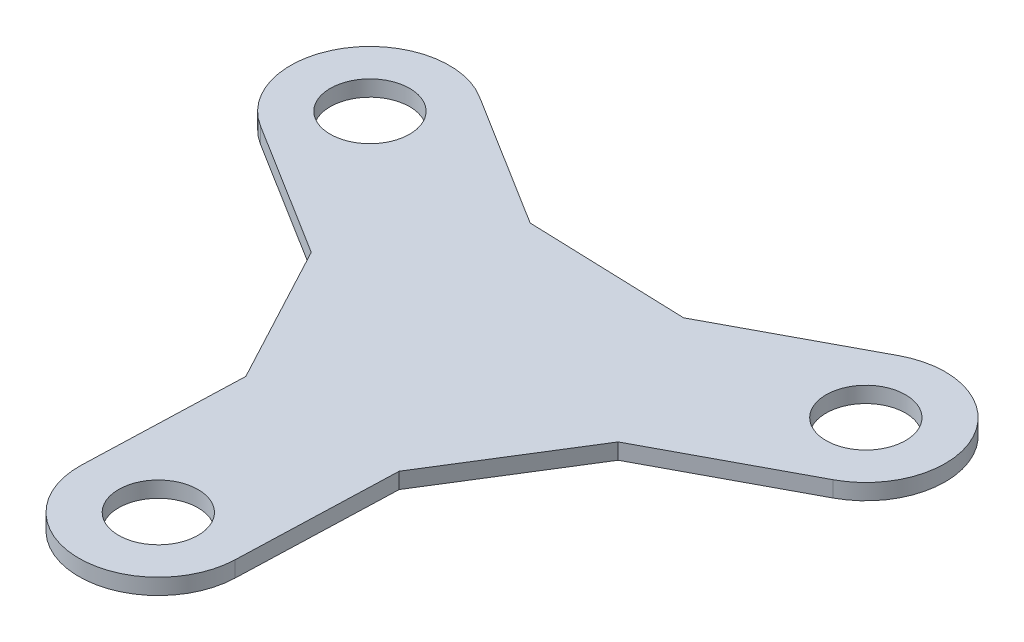
ISO-10303-21;
HEADER;
FILE_DESCRIPTION(('STEP AP214'),'2;1');
FILE_NAME('part.step','',(''),(''),'','','');
FILE_SCHEMA(('AUTOMOTIVE_DESIGN { 1 0 10303 214 1 1 1 1 }'));
ENDSEC;
DATA;
#1=APPLICATION_CONTEXT('core data for automotive mechanical design processes');
#2=APPLICATION_PROTOCOL_DEFINITION('international standard','automotive_design',2000,#1);
#3=PRODUCT_CONTEXT('',#1,'mechanical');
#4=PRODUCT('Part','Part','',(#3));
#5=PRODUCT_RELATED_PRODUCT_CATEGORY('part','',(#4));
#6=PRODUCT_DEFINITION_FORMATION('','',#4);
#7=PRODUCT_DEFINITION_CONTEXT('part definition',#1,'design');
#8=PRODUCT_DEFINITION('design','',#6,#7);
#9=PRODUCT_DEFINITION_SHAPE('','',#8);
#10=(LENGTH_UNIT() NAMED_UNIT(*) SI_UNIT(.MILLI.,.METRE.));
#11=(NAMED_UNIT(*) PLANE_ANGLE_UNIT() SI_UNIT($,.RADIAN.));
#12=(NAMED_UNIT(*) SI_UNIT($,.STERADIAN.) SOLID_ANGLE_UNIT());
#13=UNCERTAINTY_MEASURE_WITH_UNIT(LENGTH_MEASURE(1.E-05),#10,'distance_accuracy_value','');
#14=(GEOMETRIC_REPRESENTATION_CONTEXT(3) GLOBAL_UNCERTAINTY_ASSIGNED_CONTEXT((#13)) GLOBAL_UNIT_ASSIGNED_CONTEXT((#10,
#11,#12)) REPRESENTATION_CONTEXT('',''));
#15=CARTESIAN_POINT('',(0.,0.,0.));
#16=DIRECTION('',(0.,0.,1.));
#17=DIRECTION('',(1.,0.,0.));
#18=AXIS2_PLACEMENT_3D('',#15,#16,#17);
#19=CARTESIAN_POINT('',(9.40770567018427,-2.,17.6492230430459));
#20=DIRECTION('',(0.848596181161472,0.,0.529041133862166));
#21=DIRECTION('',(0.529041133862166,0.,-0.848596181161472));
#22=AXIS2_PLACEMENT_3D('',#19,#20,#21);
#23=PLANE('',#22);
#24=DIRECTION('',(0.529041133862166,0.,-0.848596181161472));
#25=VECTOR('',#24,1.);
#26=CARTESIAN_POINT('',(9.40770567018427,0.,17.6492230430459));
#27=LINE('',#26,#25);
#28=CARTESIAN_POINT('',(9.40770567018427,0.,17.6492230430459));
#29=VERTEX_POINT('',#28);
#30=CARTESIAN_POINT('',(19.9885283474276,0.,0.677299419816466));
#31=VERTEX_POINT('',#30);
#32=EDGE_CURVE('E136',#29,#31,#27,.T.);
#33=ORIENTED_EDGE('',*,*,#32,.F.);
#34=DIRECTION('',(0.,1.,0.));
#35=VECTOR('',#34,1.);
#36=CARTESIAN_POINT('',(9.40770567018427,-2.,17.6492230430459));
#37=LINE('',#36,#35);
#38=CARTESIAN_POINT('',(9.40770567018427,-2.,17.6492230430459));
#39=VERTEX_POINT('',#38);
#40=EDGE_CURVE('E51',#39,#29,#37,.T.);
#41=ORIENTED_EDGE('',*,*,#40,.F.);
#42=DIRECTION('',(0.529041133862166,0.,-0.848596181161472));
#43=VECTOR('',#42,1.);
#44=CARTESIAN_POINT('',(9.40770567018427,-2.,17.6492230430459));
#45=LINE('',#44,#43);
#46=CARTESIAN_POINT('',(19.9885283474276,-2.,0.677299419816466));
#47=VERTEX_POINT('',#46);
#48=EDGE_CURVE('E59',#39,#47,#45,.T.);
#49=ORIENTED_EDGE('',*,*,#48,.T.);
#50=DIRECTION('',(0.,1.,0.));
#51=VECTOR('',#50,1.);
#52=CARTESIAN_POINT('',(19.9885283474276,-2.,0.677299419816466));
#53=LINE('',#52,#51);
#54=EDGE_CURVE('E11',#47,#31,#53,.T.);
#55=ORIENTED_EDGE('',*,*,#54,.T.);
#56=EDGE_LOOP('',(#33,#41,#49,#55));
#57=FACE_BOUND('',#56,.T.);
#58=ADVANCED_FACE('F41',(#57),#23,.T.);
#59=CARTESIAN_POINT('',(-19.9885283474276,-2.,-0.677299419816463));
#60=DIRECTION('',(-0.882461152152295,0.,0.470385283509214));
#61=DIRECTION('',(0.470385283509214,0.,0.882461152152295));
#62=AXIS2_PLACEMENT_3D('',#59,#60,#61);
#63=PLANE('',#62);
#64=DIRECTION('',(0.470385283509214,0.,0.882461152152295));
#65=VECTOR('',#64,1.);
#66=CARTESIAN_POINT('',(-19.9885283474276,0.,-0.677299419816463));
#67=LINE('',#66,#65);
#68=CARTESIAN_POINT('',(-19.9885283474208,0.,-0.677299419816303));
#69=VERTEX_POINT('',#68);
#70=CARTESIAN_POINT('',(-10.5808226772433,0.,16.9719236232294));
#71=VERTEX_POINT('',#70);
#72=EDGE_CURVE('E141',#69,#71,#67,.T.);
#73=ORIENTED_EDGE('',*,*,#72,.F.);
#74=DIRECTION('',(0.,1.,0.));
#75=VECTOR('',#74,1.);
#76=CARTESIAN_POINT('',(-19.9885283474276,-2.,-0.677299419816463));
#77=LINE('',#76,#75);
#78=CARTESIAN_POINT('',(-19.9885283474276,-2.,-0.677299419816463));
#79=VERTEX_POINT('',#78);
#80=EDGE_CURVE('E98',#79,#69,#77,.T.);
#81=ORIENTED_EDGE('',*,*,#80,.F.);
#82=DIRECTION('',(0.470385283509214,0.,0.882461152152295));
#83=VECTOR('',#82,1.);
#84=CARTESIAN_POINT('',(-19.9885283474276,-2.,-0.677299419816463));
#85=LINE('',#84,#83);
#86=CARTESIAN_POINT('',(-10.5808226772433,-2.,16.9719236232294));
#87=VERTEX_POINT('',#86);
#88=EDGE_CURVE('E95',#79,#87,#85,.T.);
#89=ORIENTED_EDGE('',*,*,#88,.T.);
#90=DIRECTION('',(0.,1.,0.));
#91=VECTOR('',#90,1.);
#92=CARTESIAN_POINT('',(-10.5808226772433,-2.,16.9719236232294));
#93=LINE('',#92,#91);
#94=EDGE_CURVE('E74',#87,#71,#93,.T.);
#95=ORIENTED_EDGE('',*,*,#94,.T.);
#96=EDGE_LOOP('',(#73,#81,#89,#95));
#97=FACE_BOUND('',#96,.T.);
#98=ADVANCED_FACE('F96',(#97),#63,.T.);
#99=CARTESIAN_POINT('',(10.5808226772433,-2.,-16.9719236232294));
#100=DIRECTION('',(0.0338649709908231,0.,-0.999426417371379));
#101=DIRECTION('',(-0.999426417371379,0.,-0.0338649709908231));
#102=AXIS2_PLACEMENT_3D('',#99,#100,#101);
#103=PLANE('',#102);
#104=DIRECTION('',(-0.999426417371379,0.,-0.0338649709908231));
#105=VECTOR('',#104,1.);
#106=CARTESIAN_POINT('',(10.5808226772433,0.,-16.9719236232294));
#107=LINE('',#106,#105);
#108=CARTESIAN_POINT('',(10.5808226772466,0.,-16.9719236232234));
#109=VERTEX_POINT('',#108);
#110=CARTESIAN_POINT('',(-9.40770567018427,0.,-17.6492230430459));
#111=VERTEX_POINT('',#110);
#112=EDGE_CURVE('E132',#109,#111,#107,.T.);
#113=ORIENTED_EDGE('',*,*,#112,.F.);
#114=DIRECTION('',(0.,1.,0.));
#115=VECTOR('',#114,1.);
#116=CARTESIAN_POINT('',(10.5808226772433,-2.,-16.9719236232294));
#117=LINE('',#116,#115);
#118=CARTESIAN_POINT('',(10.5808226772433,-2.,-16.9719236232294));
#119=VERTEX_POINT('',#118);
#120=EDGE_CURVE('E45',#119,#109,#117,.T.);
#121=ORIENTED_EDGE('',*,*,#120,.F.);
#122=DIRECTION('',(-0.999426417371379,0.,-0.0338649709908231));
#123=VECTOR('',#122,1.);
#124=CARTESIAN_POINT('',(10.5808226772433,-2.,-16.9719236232294));
#125=LINE('',#124,#123);
#126=CARTESIAN_POINT('',(-9.40770567018427,-2.,-17.6492230430459));
#127=VERTEX_POINT('',#126);
#128=EDGE_CURVE('E103',#119,#127,#125,.T.);
#129=ORIENTED_EDGE('',*,*,#128,.T.);
#130=DIRECTION('',(0.,1.,0.));
#131=VECTOR('',#130,1.);
#132=CARTESIAN_POINT('',(-9.40770567018427,-2.,-17.6492230430459));
#133=LINE('',#132,#131);
#134=EDGE_CURVE('E146',#127,#111,#133,.T.);
#135=ORIENTED_EDGE('',*,*,#134,.T.);
#136=EDGE_LOOP('',(#113,#121,#129,#135));
#137=FACE_BOUND('',#136,.T.);
#138=ADVANCED_FACE('F43',(#137),#103,.T.);
#139=CARTESIAN_POINT('',(0.,-2.,0.));
#140=DIRECTION('',(0.,1.,0.));
#141=DIRECTION('',(0.,0.,1.));
#142=AXIS2_PLACEMENT_3D('',#139,#140,#141);
#143=PLANE('',#142);
#144=ORIENTED_EDGE('',*,*,#128,.F.);
#145=DIRECTION('',(0.882461152152296,0.,-0.470385283509213));
#146=VECTOR('',#145,1.);
#147=CARTESIAN_POINT('',(28.2300457202925,-2.,-26.3796292934077));
#148=LINE('',#147,#146);
#149=CARTESIAN_POINT('',(28.2300457202925,-2.,-26.3796292934077));
#150=VERTEX_POINT('',#149);
#151=EDGE_CURVE('E158',#119,#150,#148,.T.);
#152=ORIENTED_EDGE('',*,*,#151,.T.);
#153=CARTESIAN_POINT('',(32.9338985553847,-2.,-17.5550177718847));
#154=DIRECTION('',(0.,-1.,0.));
#155=DIRECTION('',(0.,0.,-1.));
#156=AXIS2_PLACEMENT_3D('',#153,#154,#155);
#157=CIRCLE('',#156,9.99999999999999);
#158=CARTESIAN_POINT('',(37.6377513904768,-2.,-8.73040625036178));
#159=VERTEX_POINT('',#158);
#160=EDGE_CURVE('E175',#150,#159,#157,.T.);
#161=ORIENTED_EDGE('',*,*,#160,.T.);
#162=DIRECTION('',(-0.882461152152296,0.,0.470385283509213));
#163=VECTOR('',#162,1.);
#164=CARTESIAN_POINT('',(19.9885283474309,-2.,0.677299419822484));
#165=LINE('',#164,#163);
#166=EDGE_CURVE('E170',#159,#47,#165,.T.);
#167=ORIENTED_EDGE('',*,*,#166,.T.);
#168=ORIENTED_EDGE('',*,*,#48,.F.);
#169=DIRECTION('',(-0.0338649709908238,0.,0.999426417371379));
#170=VECTOR('',#169,1.);
#171=CARTESIAN_POINT('',(8.7304062503678,-2.,37.6377513904735));
#172=LINE('',#171,#170);
#173=CARTESIAN_POINT('',(8.7304062503678,-2.,37.6377513904735));
#174=VERTEX_POINT('',#173);
#175=EDGE_CURVE('E125',#39,#174,#172,.T.);
#176=ORIENTED_EDGE('',*,*,#175,.T.);
#177=CARTESIAN_POINT('',(-1.26385792334599,-2.,37.2991016805653));
#178=DIRECTION('',(0.,-1.,0.));
#179=DIRECTION('',(0.,0.,-1.));
#180=AXIS2_PLACEMENT_3D('',#177,#178,#179);
#181=CIRCLE('',#180,10.);
#182=CARTESIAN_POINT('',(-11.2581220970598,-2.,36.960451970657));
#183=VERTEX_POINT('',#182);
#184=EDGE_CURVE('E119',#174,#183,#181,.T.);
#185=ORIENTED_EDGE('',*,*,#184,.T.);
#186=DIRECTION('',(0.0338649709908236,0.,-0.999426417371379));
#187=VECTOR('',#186,1.);
#188=CARTESIAN_POINT('',(-10.5808226772433,-2.,16.9719236232294));
#189=LINE('',#188,#187);
#190=EDGE_CURVE('E110',#183,#87,#189,.T.);
#191=ORIENTED_EDGE('',*,*,#190,.T.);
#192=ORIENTED_EDGE('',*,*,#88,.F.);
#193=DIRECTION('',(-0.848596181161472,0.,-0.529041133862166));
#194=VECTOR('',#193,1.);
#195=CARTESIAN_POINT('',(-36.9604519706502,-2.,-11.2581220970596));
#196=LINE('',#195,#194);
#197=CARTESIAN_POINT('',(-36.9604519706502,-2.,-11.2581220970596));
#198=VERTEX_POINT('',#197);
#199=EDGE_CURVE('E241',#79,#198,#196,.T.);
#200=ORIENTED_EDGE('',*,*,#199,.T.);
#201=CARTESIAN_POINT('',(-31.6700406320285,-2.,-19.7440839086744));
#202=DIRECTION('',(0.,-1.,0.));
#203=DIRECTION('',(0.,0.,-1.));
#204=AXIS2_PLACEMENT_3D('',#201,#202,#203);
#205=CIRCLE('',#204,10.);
#206=CARTESIAN_POINT('',(-26.3796292934069,-2.,-28.2300457202891));
#207=VERTEX_POINT('',#206);
#208=EDGE_CURVE('E250',#198,#207,#205,.T.);
#209=ORIENTED_EDGE('',*,*,#208,.T.);
#210=DIRECTION('',(0.848596181161472,0.,0.529041133862166));
#211=VECTOR('',#210,1.);
#212=CARTESIAN_POINT('',(-9.40770567017742,-2.,-17.6492230430457));
#213=LINE('',#212,#211);
#214=EDGE_CURVE('E245',#207,#127,#213,.T.);
#215=ORIENTED_EDGE('',*,*,#214,.T.);
#216=EDGE_LOOP('',(#144,#152,#161,#167,#168,#176,#185,#191,#192,#200,#209,#215));
#217=FACE_BOUND('',#216,.T.);
#218=CARTESIAN_POINT('',(-1.26385792334599,-2.,37.2991016805653));
#219=DIRECTION('',(0.,-1.,0.));
#220=DIRECTION('',(0.,0.,-1.));
#221=AXIS2_PLACEMENT_3D('',#218,#219,#220);
#222=CIRCLE('',#221,5.);
#223=CARTESIAN_POINT('',(-1.26385792334599,-2.,32.2991016805653));
#224=VERTEX_POINT('',#223);
#225=EDGE_CURVE('E191',#224,#224,#222,.T.);
#226=ORIENTED_EDGE('',*,*,#225,.F.);
#227=EDGE_LOOP('',(#226));
#228=FACE_BOUND('',#227,.T.);
#229=CARTESIAN_POINT('',(32.9338985553847,-2.,-17.5550177718847));
#230=DIRECTION('',(0.,-1.,0.));
#231=DIRECTION('',(0.,0.,-1.));
#232=AXIS2_PLACEMENT_3D('',#229,#230,#231);
#233=CIRCLE('',#232,5.0000000000068);
#234=CARTESIAN_POINT('',(32.9338985553847,-2.,-22.5550177718915));
#235=VERTEX_POINT('',#234);
#236=EDGE_CURVE('E178',#235,#235,#233,.T.);
#237=ORIENTED_EDGE('',*,*,#236,.F.);
#238=EDGE_LOOP('',(#237));
#239=FACE_BOUND('',#238,.T.);
#240=CARTESIAN_POINT('',(-31.6700406320285,-2.,-19.7440839086744));
#241=DIRECTION('',(0.,-1.,0.));
#242=DIRECTION('',(0.,0.,-1.));
#243=AXIS2_PLACEMENT_3D('',#240,#241,#242);
#244=CIRCLE('',#243,5.00000000000524);
#245=CARTESIAN_POINT('',(-31.6700406320285,-2.,-24.7440839086796));
#246=VERTEX_POINT('',#245);
#247=EDGE_CURVE('E253',#246,#246,#244,.T.);
#248=ORIENTED_EDGE('',*,*,#247,.F.);
#249=EDGE_LOOP('',(#248));
#250=FACE_BOUND('',#249,.T.);
#251=ADVANCED_FACE('F115',(#217,#228,#239,#250),#143,.F.);
#252=CARTESIAN_POINT('',(0.,0.,0.));
#253=DIRECTION('',(0.,1.,0.));
#254=DIRECTION('',(0.,0.,1.));
#255=AXIS2_PLACEMENT_3D('',#252,#253,#254);
#256=PLANE('',#255);
#257=ORIENTED_EDGE('',*,*,#32,.T.);
#258=DIRECTION('',(-0.882461152152296,0.,0.470385283509213));
#259=VECTOR('',#258,1.);
#260=CARTESIAN_POINT('',(19.9885283474309,0.,0.677299419822484));
#261=LINE('',#260,#259);
#262=CARTESIAN_POINT('',(37.6377513904768,0.,-8.73040625036178));
#263=VERTEX_POINT('',#262);
#264=EDGE_CURVE('E172',#263,#31,#261,.T.);
#265=ORIENTED_EDGE('',*,*,#264,.F.);
#266=CARTESIAN_POINT('',(32.9338985553847,0.,-17.5550177718847));
#267=DIRECTION('',(0.,-1.,0.));
#268=DIRECTION('',(0.,0.,-1.));
#269=AXIS2_PLACEMENT_3D('',#266,#267,#268);
#270=CIRCLE('',#269,9.99999999999999);
#271=CARTESIAN_POINT('',(28.2300457202925,0.,-26.3796292934077));
#272=VERTEX_POINT('',#271);
#273=EDGE_CURVE('E169',#272,#263,#270,.T.);
#274=ORIENTED_EDGE('',*,*,#273,.F.);
#275=DIRECTION('',(0.882461152152296,0.,-0.470385283509213));
#276=VECTOR('',#275,1.);
#277=CARTESIAN_POINT('',(28.2300457202925,0.,-26.3796292934077));
#278=LINE('',#277,#276);
#279=EDGE_CURVE('E156',#109,#272,#278,.T.);
#280=ORIENTED_EDGE('',*,*,#279,.F.);
#281=ORIENTED_EDGE('',*,*,#112,.T.);
#282=DIRECTION('',(0.848596181161472,0.,0.529041133862166));
#283=VECTOR('',#282,1.);
#284=CARTESIAN_POINT('',(-9.40770567017742,0.,-17.6492230430457));
#285=LINE('',#284,#283);
#286=CARTESIAN_POINT('',(-26.3796292934069,0.,-28.2300457202891));
#287=VERTEX_POINT('',#286);
#288=EDGE_CURVE('E247',#287,#111,#285,.T.);
#289=ORIENTED_EDGE('',*,*,#288,.F.);
#290=CARTESIAN_POINT('',(-31.6700406320285,0.,-19.7440839086744));
#291=DIRECTION('',(0.,-1.,0.));
#292=DIRECTION('',(0.,0.,-1.));
#293=AXIS2_PLACEMENT_3D('',#290,#291,#292);
#294=CIRCLE('',#293,10.);
#295=CARTESIAN_POINT('',(-36.9604519706502,0.,-11.2581220970596));
#296=VERTEX_POINT('',#295);
#297=EDGE_CURVE('E244',#296,#287,#294,.T.);
#298=ORIENTED_EDGE('',*,*,#297,.F.);
#299=DIRECTION('',(-0.848596181161472,0.,-0.529041133862166));
#300=VECTOR('',#299,1.);
#301=CARTESIAN_POINT('',(-36.9604519706502,0.,-11.2581220970596));
#302=LINE('',#301,#300);
#303=EDGE_CURVE('E240',#69,#296,#302,.T.);
#304=ORIENTED_EDGE('',*,*,#303,.F.);
#305=ORIENTED_EDGE('',*,*,#72,.T.);
#306=DIRECTION('',(0.0338649709908236,0.,-0.999426417371379));
#307=VECTOR('',#306,1.);
#308=CARTESIAN_POINT('',(-10.5808226772433,0.,16.9719236232294));
#309=LINE('',#308,#307);
#310=CARTESIAN_POINT('',(-11.2581220970598,0.,36.960451970657));
#311=VERTEX_POINT('',#310);
#312=EDGE_CURVE('E112',#311,#71,#309,.T.);
#313=ORIENTED_EDGE('',*,*,#312,.F.);
#314=CARTESIAN_POINT('',(-1.26385792334599,0.,37.2991016805653));
#315=DIRECTION('',(0.,-1.,0.));
#316=DIRECTION('',(0.,0.,-1.));
#317=AXIS2_PLACEMENT_3D('',#314,#315,#316);
#318=CIRCLE('',#317,10.);
#319=CARTESIAN_POINT('',(8.7304062503678,0.,37.6377513904735));
#320=VERTEX_POINT('',#319);
#321=EDGE_CURVE('E123',#320,#311,#318,.T.);
#322=ORIENTED_EDGE('',*,*,#321,.F.);
#323=DIRECTION('',(-0.0338649709908238,0.,0.999426417371379));
#324=VECTOR('',#323,1.);
#325=CARTESIAN_POINT('',(8.7304062503678,0.,37.6377513904735));
#326=LINE('',#325,#324);
#327=EDGE_CURVE('E120',#29,#320,#326,.T.);
#328=ORIENTED_EDGE('',*,*,#327,.F.);
#329=EDGE_LOOP('',(#257,#265,#274,#280,#281,#289,#298,#304,#305,#313,#322,#328));
#330=FACE_BOUND('',#329,.T.);
#331=CARTESIAN_POINT('',(-1.26385792334599,0.,37.2991016805653));
#332=DIRECTION('',(0.,-1.,0.));
#333=DIRECTION('',(0.,0.,-1.));
#334=AXIS2_PLACEMENT_3D('',#331,#332,#333);
#335=CIRCLE('',#334,5.);
#336=CARTESIAN_POINT('',(-1.26385792334599,0.,32.2991016805653));
#337=VERTEX_POINT('',#336);
#338=EDGE_CURVE('E193',#337,#337,#335,.T.);
#339=ORIENTED_EDGE('',*,*,#338,.T.);
#340=EDGE_LOOP('',(#339));
#341=FACE_BOUND('',#340,.T.);
#342=CARTESIAN_POINT('',(32.9338985553847,0.,-17.5550177718847));
#343=DIRECTION('',(0.,-1.,0.));
#344=DIRECTION('',(0.,0.,-1.));
#345=AXIS2_PLACEMENT_3D('',#342,#343,#344);
#346=CIRCLE('',#345,5.0000000000068);
#347=CARTESIAN_POINT('',(32.9338985553847,0.,-22.5550177718915));
#348=VERTEX_POINT('',#347);
#349=EDGE_CURVE('E185',#348,#348,#346,.T.);
#350=ORIENTED_EDGE('',*,*,#349,.T.);
#351=EDGE_LOOP('',(#350));
#352=FACE_BOUND('',#351,.T.);
#353=CARTESIAN_POINT('',(-31.6700406320285,0.,-19.7440839086744));
#354=DIRECTION('',(0.,-1.,0.));
#355=DIRECTION('',(0.,0.,-1.));
#356=AXIS2_PLACEMENT_3D('',#353,#354,#355);
#357=CIRCLE('',#356,5.00000000000524);
#358=CARTESIAN_POINT('',(-31.6700406320285,0.,-24.7440839086796));
#359=VERTEX_POINT('',#358);
#360=EDGE_CURVE('E259',#359,#359,#357,.T.);
#361=ORIENTED_EDGE('',*,*,#360,.T.);
#362=EDGE_LOOP('',(#361));
#363=FACE_BOUND('',#362,.T.);
#364=ADVANCED_FACE('F163',(#330,#341,#352,#363),#256,.T.);
#365=CARTESIAN_POINT('',(-10.5808226772433,0.,16.9719236232294));
#366=DIRECTION('',(-0.999426417371379,0.,-0.0338649709908236));
#367=DIRECTION('',(-0.0338649709908236,0.,0.999426417371379));
#368=AXIS2_PLACEMENT_3D('',#365,#366,#367);
#369=PLANE('',#368);
#370=ORIENTED_EDGE('',*,*,#190,.F.);
#371=DIRECTION('',(0.,-1.,0.));
#372=VECTOR('',#371,1.);
#373=CARTESIAN_POINT('',(-11.2581220970598,0.,36.960451970657));
#374=LINE('',#373,#372);
#375=EDGE_CURVE('E129',#311,#183,#374,.T.);
#376=ORIENTED_EDGE('',*,*,#375,.F.);
#377=ORIENTED_EDGE('',*,*,#312,.T.);
#378=ORIENTED_EDGE('',*,*,#94,.F.);
#379=EDGE_LOOP('',(#370,#376,#377,#378));
#380=FACE_BOUND('',#379,.T.);
#381=ADVANCED_FACE('F108',(#380),#369,.T.);
#382=CARTESIAN_POINT('',(-1.26385792334599,0.,37.2991016805653));
#383=DIRECTION('',(0.,-1.,0.));
#384=DIRECTION('',(0.,0.,-1.));
#385=AXIS2_PLACEMENT_3D('',#382,#383,#384);
#386=CYLINDRICAL_SURFACE('',#385,10.);
#387=ORIENTED_EDGE('',*,*,#184,.F.);
#388=DIRECTION('',(0.,-1.,0.));
#389=VECTOR('',#388,1.);
#390=CARTESIAN_POINT('',(8.7304062503678,0.,37.6377513904735));
#391=LINE('',#390,#389);
#392=EDGE_CURVE('E133',#320,#174,#391,.T.);
#393=ORIENTED_EDGE('',*,*,#392,.F.);
#394=ORIENTED_EDGE('',*,*,#321,.T.);
#395=ORIENTED_EDGE('',*,*,#375,.T.);
#396=EDGE_LOOP('',(#387,#393,#394,#395));
#397=FACE_BOUND('',#396,.T.);
#398=ADVANCED_FACE('F211',(#397),#386,.T.);
#399=CARTESIAN_POINT('',(8.7304062503678,0.,37.6377513904735));
#400=DIRECTION('',(0.999426417371379,0.,0.0338649709908238));
#401=DIRECTION('',(0.0338649709908238,0.,-0.999426417371379));
#402=AXIS2_PLACEMENT_3D('',#399,#400,#401);
#403=PLANE('',#402);
#404=ORIENTED_EDGE('',*,*,#175,.F.);
#405=ORIENTED_EDGE('',*,*,#40,.T.);
#406=ORIENTED_EDGE('',*,*,#327,.T.);
#407=ORIENTED_EDGE('',*,*,#392,.T.);
#408=EDGE_LOOP('',(#404,#405,#406,#407));
#409=FACE_BOUND('',#408,.T.);
#410=ADVANCED_FACE('F204',(#409),#403,.T.);
#411=CARTESIAN_POINT('',(-1.26385792334599,0.,37.2991016805653));
#412=DIRECTION('',(0.,-1.,0.));
#413=DIRECTION('',(0.,0.,-1.));
#414=AXIS2_PLACEMENT_3D('',#411,#412,#413);
#415=CYLINDRICAL_SURFACE('',#414,5.);
#416=ORIENTED_EDGE('',*,*,#338,.F.);
#417=EDGE_LOOP('',(#416));
#418=FACE_BOUND('',#417,.T.);
#419=ORIENTED_EDGE('',*,*,#225,.T.);
#420=EDGE_LOOP('',(#419));
#421=FACE_BOUND('',#420,.T.);
#422=ADVANCED_FACE('F301',(#418,#421),#415,.F.);
#423=CARTESIAN_POINT('',(19.9885283474309,0.,0.677299419822484));
#424=DIRECTION('',(0.470385283509213,0.,0.882461152152296));
#425=DIRECTION('',(0.882461152152296,0.,-0.470385283509213));
#426=AXIS2_PLACEMENT_3D('',#423,#424,#425);
#427=PLANE('',#426);
#428=ORIENTED_EDGE('',*,*,#166,.F.);
#429=DIRECTION('',(0.,-1.,0.));
#430=VECTOR('',#429,1.);
#431=CARTESIAN_POINT('',(37.6377513904768,0.,-8.73040625036178));
#432=LINE('',#431,#430);
#433=EDGE_CURVE('E188',#263,#159,#432,.T.);
#434=ORIENTED_EDGE('',*,*,#433,.F.);
#435=ORIENTED_EDGE('',*,*,#264,.T.);
#436=ORIENTED_EDGE('',*,*,#54,.F.);
#437=EDGE_LOOP('',(#428,#434,#435,#436));
#438=FACE_BOUND('',#437,.T.);
#439=ADVANCED_FACE('F308',(#438),#427,.T.);
#440=CARTESIAN_POINT('',(32.9338985553847,0.,-17.5550177718847));
#441=DIRECTION('',(0.,-1.,0.));
#442=DIRECTION('',(0.,0.,-1.));
#443=AXIS2_PLACEMENT_3D('',#440,#441,#442);
#444=CYLINDRICAL_SURFACE('',#443,9.99999999999999);
#445=ORIENTED_EDGE('',*,*,#160,.F.);
#446=DIRECTION('',(0.,-1.,0.));
#447=VECTOR('',#446,1.);
#448=CARTESIAN_POINT('',(28.2300457202925,0.,-26.3796292934077));
#449=LINE('',#448,#447);
#450=EDGE_CURVE('E183',#272,#150,#449,.T.);
#451=ORIENTED_EDGE('',*,*,#450,.F.);
#452=ORIENTED_EDGE('',*,*,#273,.T.);
#453=ORIENTED_EDGE('',*,*,#433,.T.);
#454=EDGE_LOOP('',(#445,#451,#452,#453));
#455=FACE_BOUND('',#454,.T.);
#456=ADVANCED_FACE('F312',(#455),#444,.T.);
#457=CARTESIAN_POINT('',(28.2300457202925,0.,-26.3796292934077));
#458=DIRECTION('',(-0.470385283509213,0.,-0.882461152152296));
#459=DIRECTION('',(-0.882461152152296,0.,0.470385283509213));
#460=AXIS2_PLACEMENT_3D('',#457,#458,#459);
#461=PLANE('',#460);
#462=ORIENTED_EDGE('',*,*,#151,.F.);
#463=ORIENTED_EDGE('',*,*,#120,.T.);
#464=ORIENTED_EDGE('',*,*,#279,.T.);
#465=ORIENTED_EDGE('',*,*,#450,.T.);
#466=EDGE_LOOP('',(#462,#463,#464,#465));
#467=FACE_BOUND('',#466,.T.);
#468=ADVANCED_FACE('F153',(#467),#461,.T.);
#469=CARTESIAN_POINT('',(32.9338985553847,0.,-17.5550177718847));
#470=DIRECTION('',(0.,-1.,0.));
#471=DIRECTION('',(0.,0.,-1.));
#472=AXIS2_PLACEMENT_3D('',#469,#470,#471);
#473=CYLINDRICAL_SURFACE('',#472,5.0000000000068);
#474=ORIENTED_EDGE('',*,*,#349,.F.);
#475=EDGE_LOOP('',(#474));
#476=FACE_BOUND('',#475,.T.);
#477=ORIENTED_EDGE('',*,*,#236,.T.);
#478=EDGE_LOOP('',(#477));
#479=FACE_BOUND('',#478,.T.);
#480=ADVANCED_FACE('F270',(#476,#479),#473,.F.);
#481=CARTESIAN_POINT('',(-9.40770567017742,0.,-17.6492230430457));
#482=DIRECTION('',(0.529041133862166,0.,-0.848596181161472));
#483=DIRECTION('',(-0.848596181161472,0.,-0.529041133862166));
#484=AXIS2_PLACEMENT_3D('',#481,#482,#483);
#485=PLANE('',#484);
#486=ORIENTED_EDGE('',*,*,#214,.F.);
#487=DIRECTION('',(0.,-1.,0.));
#488=VECTOR('',#487,1.);
#489=CARTESIAN_POINT('',(-26.3796292934069,0.,-28.2300457202891));
#490=LINE('',#489,#488);
#491=EDGE_CURVE('E262',#287,#207,#490,.T.);
#492=ORIENTED_EDGE('',*,*,#491,.F.);
#493=ORIENTED_EDGE('',*,*,#288,.T.);
#494=ORIENTED_EDGE('',*,*,#134,.F.);
#495=EDGE_LOOP('',(#486,#492,#493,#494));
#496=FACE_BOUND('',#495,.T.);
#497=ADVANCED_FACE('F320',(#496),#485,.T.);
#498=CARTESIAN_POINT('',(-31.6700406320285,0.,-19.7440839086744));
#499=DIRECTION('',(0.,-1.,0.));
#500=DIRECTION('',(0.,0.,-1.));
#501=AXIS2_PLACEMENT_3D('',#498,#499,#500);
#502=CYLINDRICAL_SURFACE('',#501,10.);
#503=ORIENTED_EDGE('',*,*,#208,.F.);
#504=DIRECTION('',(0.,-1.,0.));
#505=VECTOR('',#504,1.);
#506=CARTESIAN_POINT('',(-36.9604519706502,0.,-11.2581220970596));
#507=LINE('',#506,#505);
#508=EDGE_CURVE('E257',#296,#198,#507,.T.);
#509=ORIENTED_EDGE('',*,*,#508,.F.);
#510=ORIENTED_EDGE('',*,*,#297,.T.);
#511=ORIENTED_EDGE('',*,*,#491,.T.);
#512=EDGE_LOOP('',(#503,#509,#510,#511));
#513=FACE_BOUND('',#512,.T.);
#514=ADVANCED_FACE('F288',(#513),#502,.T.);
#515=CARTESIAN_POINT('',(-36.9604519706502,0.,-11.2581220970596));
#516=DIRECTION('',(-0.529041133862166,0.,0.848596181161472));
#517=DIRECTION('',(0.848596181161472,0.,0.529041133862166));
#518=AXIS2_PLACEMENT_3D('',#515,#516,#517);
#519=PLANE('',#518);
#520=ORIENTED_EDGE('',*,*,#199,.F.);
#521=ORIENTED_EDGE('',*,*,#80,.T.);
#522=ORIENTED_EDGE('',*,*,#303,.T.);
#523=ORIENTED_EDGE('',*,*,#508,.T.);
#524=EDGE_LOOP('',(#520,#521,#522,#523));
#525=FACE_BOUND('',#524,.T.);
#526=ADVANCED_FACE('F239',(#525),#519,.T.);
#527=CARTESIAN_POINT('',(-31.6700406320285,0.,-19.7440839086744));
#528=DIRECTION('',(0.,-1.,0.));
#529=DIRECTION('',(0.,0.,-1.));
#530=AXIS2_PLACEMENT_3D('',#527,#528,#529);
#531=CYLINDRICAL_SURFACE('',#530,5.00000000000524);
#532=ORIENTED_EDGE('',*,*,#360,.F.);
#533=EDGE_LOOP('',(#532));
#534=FACE_BOUND('',#533,.T.);
#535=ORIENTED_EDGE('',*,*,#247,.T.);
#536=EDGE_LOOP('',(#535));
#537=FACE_BOUND('',#536,.T.);
#538=ADVANCED_FACE('F282',(#534,#537),#531,.F.);
#539=CLOSED_SHELL('',(#58,#98,#138,#251,#364,#381,#398,#410,#422,#439,#456,#468,#480,#497,#514,
#526,#538));
#540=MANIFOLD_SOLID_BREP('B2',#539);
#541=ADVANCED_BREP_SHAPE_REPRESENTATION('',(#18,#540),#14);
#542=SHAPE_DEFINITION_REPRESENTATION(#9,#541);
ENDSEC;
END-ISO-10303-21;
